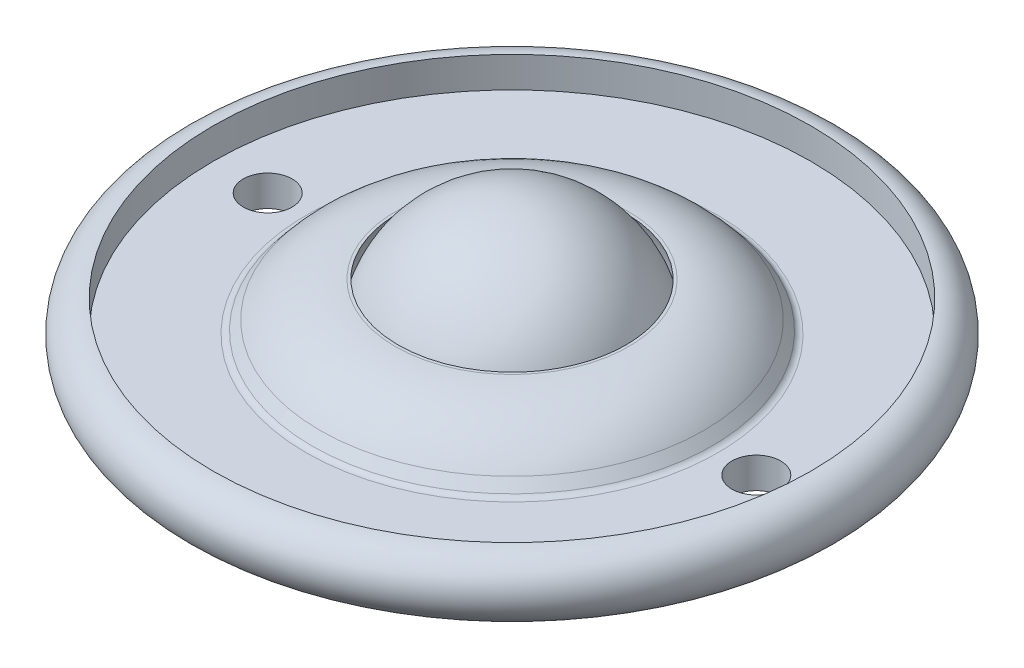
ISO-10303-21;
HEADER;
FILE_DESCRIPTION(('STEP AP214'),'2;1');
FILE_NAME('part.step','',(''),(''),'','','');
FILE_SCHEMA(('AUTOMOTIVE_DESIGN { 1 0 10303 214 1 1 1 1 }'));
ENDSEC;
DATA;
#1=APPLICATION_CONTEXT('core data for automotive mechanical design processes');
#2=APPLICATION_PROTOCOL_DEFINITION('international standard','automotive_design',2000,#1);
#3=PRODUCT_CONTEXT('',#1,'mechanical');
#4=PRODUCT('Part','Part','',(#3));
#5=PRODUCT_RELATED_PRODUCT_CATEGORY('part','',(#4));
#6=PRODUCT_DEFINITION_FORMATION('','',#4);
#7=PRODUCT_DEFINITION_CONTEXT('part definition',#1,'design');
#8=PRODUCT_DEFINITION('design','',#6,#7);
#9=PRODUCT_DEFINITION_SHAPE('','',#8);
#10=(LENGTH_UNIT() NAMED_UNIT(*) SI_UNIT(.MILLI.,.METRE.));
#11=(NAMED_UNIT(*) PLANE_ANGLE_UNIT() SI_UNIT($,.RADIAN.));
#12=(NAMED_UNIT(*) SI_UNIT($,.STERADIAN.) SOLID_ANGLE_UNIT());
#13=UNCERTAINTY_MEASURE_WITH_UNIT(LENGTH_MEASURE(1.E-05),#10,'distance_accuracy_value','');
#14=(GEOMETRIC_REPRESENTATION_CONTEXT(3) GLOBAL_UNCERTAINTY_ASSIGNED_CONTEXT((#13)) GLOBAL_UNIT_ASSIGNED_CONTEXT((#10,
#11,#12)) REPRESENTATION_CONTEXT('',''));
#15=CARTESIAN_POINT('',(0.,0.,0.));
#16=DIRECTION('',(0.,0.,1.));
#17=DIRECTION('',(1.,0.,0.));
#18=AXIS2_PLACEMENT_3D('',#15,#16,#17);
#19=CARTESIAN_POINT('',(0.,0.,0.));
#20=DIRECTION('',(-1.,0.,0.));
#21=DIRECTION('',(0.,-1.,0.));
#22=AXIS2_PLACEMENT_3D('',#19,#20,#21);
#23=SPHERICAL_SURFACE('',#22,7.9375);
#24=CARTESIAN_POINT('',(-7.9375,0.,0.));
#25=VERTEX_POINT('',#24);
#26=VERTEX_LOOP('',#25);
#27=FACE_BOUND('',#26,.T.);
#28=ADVANCED_FACE('P0_F29',(#27),#23,.T.);
#29=CLOSED_SHELL('',(#28));
#30=MANIFOLD_SOLID_BREP('P0_B2',#29);
#31=CARTESIAN_POINT('',(0.,0.,0.));
#32=DIRECTION('',(-1.,0.,0.));
#33=DIRECTION('',(0.,1.,0.));
#34=AXIS2_PLACEMENT_3D('',#31,#32,#33);
#35=SPHERICAL_SURFACE('',#34,8.1915);
#36=CARTESIAN_POINT('',(-8.1915,0.,0.));
#37=VERTEX_POINT('',#36);
#38=VERTEX_LOOP('',#37);
#39=FACE_BOUND('',#38,.T.);
#40=CARTESIAN_POINT('',(8.1915,0.,0.));
#41=VERTEX_POINT('',#40);
#42=VERTEX_LOOP('',#41);
#43=FACE_BOUND('',#42,.T.);
#44=CARTESIAN_POINT('',(7.40612396939182,3.5,0.));
#45=CARTESIAN_POINT('',(7.40612282148996,3.5,0.207940520973274));
#46=CARTESIAN_POINT('',(7.39735917364303,3.5,0.415918737296631));
#47=CARTESIAN_POINT('',(7.36235883640199,3.5,0.830441272775987));
#48=CARTESIAN_POINT('',(7.33611698841852,3.5,1.03698515040484));
#49=CARTESIAN_POINT('',(7.26628707660596,3.5,1.44746340308336));
#50=CARTESIAN_POINT('',(7.22267147766759,3.5,1.65139310289263));
#51=CARTESIAN_POINT('',(7.11836214138648,3.5,2.05501267208273));
#52=CARTESIAN_POINT('',(7.05765454497674,3.49999999999999,2.25469895878464));
#53=CARTESIAN_POINT('',(6.91972793600326,3.49999999999999,2.64789913925064));
#54=CARTESIAN_POINT('',(6.84253753164151,3.5,2.84142306828194));
#55=CARTESIAN_POINT('',(6.67209342038976,3.5,3.22136830532712));
#56=CARTESIAN_POINT('',(6.57883245624484,3.5,3.40778635777037));
#57=CARTESIAN_POINT('',(6.37693084838602,3.5,3.77210822324107));
#58=CARTESIAN_POINT('',(6.26828962845491,3.5,3.95001171693853));
#59=CARTESIAN_POINT('',(6.03645533228709,3.5,4.29595338487754));
#60=CARTESIAN_POINT('',(5.91326884614348,3.5,4.46399597557631));
#61=CARTESIAN_POINT('',(5.65309604669321,3.5,4.78921385581058));
#62=CARTESIAN_POINT('',(5.51610087044069,3.5,4.94638205521472));
#63=CARTESIAN_POINT('',(5.22949034453452,3.5,5.24846755038119));
#64=CARTESIAN_POINT('',(5.07988728997768,3.5,5.39339651175837));
#65=CARTESIAN_POINT('',(4.76893914905491,3.5,5.67020628220635));
#66=CARTESIAN_POINT('',(4.60758877434579,3.5,5.80208115083394));
#67=CARTESIAN_POINT('',(4.27431424591399,3.5,6.05179955301286));
#68=CARTESIAN_POINT('',(4.10238765183991,3.5,6.16963982967398));
#69=CARTESIAN_POINT('',(3.74924544164275,3.5,6.39039786001625));
#70=CARTESIAN_POINT('',(3.56803131925938,3.5,6.49331800321436));
#71=CARTESIAN_POINT('',(3.19757449291373,3.5,6.68352786354436));
#72=CARTESIAN_POINT('',(3.00833168015645,3.5,6.77081736878521));
#73=CARTESIAN_POINT('',(2.62316969562391,3.5,6.92914180103011));
#74=CARTESIAN_POINT('',(2.42725067882988,3.5,7.00017710506387));
#75=CARTESIAN_POINT('',(2.03012265742002,3.5,7.12549144340822));
#76=CARTESIAN_POINT('',(1.82891359229986,3.5,7.1797702859781));
#77=CARTESIAN_POINT('',(1.42268145700651,3.5,7.27117496467168));
#78=CARTESIAN_POINT('',(1.21765920825493,3.5,7.30830445152736));
#79=CARTESIAN_POINT('',(0.805128181684861,3.5,7.36517571451882));
#80=CARTESIAN_POINT('',(0.597618383425741,3.5,7.38491008891321));
#81=CARTESIAN_POINT('',(0.18167391377182,3.5,7.40682383634141));
#82=CARTESIAN_POINT('',(-0.0267607576229801,3.5,7.40900320937523));
#83=CARTESIAN_POINT('',(-0.442983910328806,3.5,7.39579428857053));
#84=CARTESIAN_POINT('',(-0.65077262867887,3.5,7.38041346272286));
#85=CARTESIAN_POINT('',(-1.06436042669156,3.5,7.33220043163075));
#86=CARTESIAN_POINT('',(-1.27015907308772,3.5,7.29936450955197));
#87=CARTESIAN_POINT('',(-1.67825628086044,3.5,7.21647290689108));
#88=CARTESIAN_POINT('',(-1.88055488225887,3.5,7.16641742334583));
#89=CARTESIAN_POINT('',(-2.28022089649986,3.5,7.04944111277211));
#90=CARTESIAN_POINT('',(-2.47758819483629,3.5,6.98251989451618));
#91=CARTESIAN_POINT('',(-2.86598088128762,3.5,6.83228949724596));
#92=CARTESIAN_POINT('',(-3.05700635533038,3.5,6.74898054038156));
#93=CARTESIAN_POINT('',(-3.43139018672869,3.5,6.56655171762853));
#94=CARTESIAN_POINT('',(-3.61474730969693,3.5,6.46742931849346));
#95=CARTESIAN_POINT('',(-3.97241651294724,3.5,6.25411281014373));
#96=CARTESIAN_POINT('',(-4.14673067784701,3.5,6.13992219621416));
#97=CARTESIAN_POINT('',(-4.48504376915096,3.5,5.89731830586787));
#98=CARTESIAN_POINT('',(-4.64904733041881,3.5,5.76891149269166));
#99=CARTESIAN_POINT('',(-4.96581343392468,3.5,5.49861447898287));
#100=CARTESIAN_POINT('',(-5.11856497491781,3.5,5.35671138548374));
#101=CARTESIAN_POINT('',(-5.4114703895838,3.5,5.06063204939761));
#102=CARTESIAN_POINT('',(-5.55163233212859,3.5,4.90646378898311));
#103=CARTESIAN_POINT('',(-5.81853371555242,3.5,4.58679766625113));
#104=CARTESIAN_POINT('',(-5.94526706688843,3.5,4.42129471945854));
#105=CARTESIAN_POINT('',(-6.1843328019622,3.5,4.08020491423173));
#106=CARTESIAN_POINT('',(-6.29666572517306,3.5,3.90461843390686));
#107=CARTESIAN_POINT('',(-6.50608976589227,3.5,3.54468628838141));
#108=CARTESIAN_POINT('',(-6.60318775839457,3.5,3.36034462329925));
#109=CARTESIAN_POINT('',(-6.78166709993964,3.5,2.98381407205134));
#110=CARTESIAN_POINT('',(-6.86302105362819,3.5,2.79161220010966));
#111=CARTESIAN_POINT('',(-7.00916406233124,3.5,2.40118753993073));
#112=CARTESIAN_POINT('',(-7.07396652323318,3.5,2.20296977080772));
#113=CARTESIAN_POINT('',(-7.18654167201185,3.5,1.80210140290721));
#114=CARTESIAN_POINT('',(-7.23434125130595,3.5,1.59945834679411));
#115=CARTESIAN_POINT('',(-7.31270459977394,3.5,1.19090829888798));
#116=CARTESIAN_POINT('',(-7.34327345258538,3.49999999999999,0.985002288226753));
#117=CARTESIAN_POINT('',(-7.3787800101845,3.49999999999999,0.648980674116404));
#118=CARTESIAN_POINT('',(-7.38903079348099,3.5,0.519403359652995));
#119=CARTESIAN_POINT('',(-7.40270313177363,3.5,0.259888937544582));
#120=CARTESIAN_POINT('',(-7.40612468676978,3.5,0.129951829899579));
#121=CARTESIAN_POINT('',(-7.40612282148997,3.5,-0.207940520973277));
#122=CARTESIAN_POINT('',(-7.39735917364303,3.5,-0.415918737296633));
#123=CARTESIAN_POINT('',(-7.36235883640199,3.5,-0.830441272775988));
#124=CARTESIAN_POINT('',(-7.33611698841852,3.5,-1.03698515040484));
#125=CARTESIAN_POINT('',(-7.26628707660596,3.5,-1.44746340308335));
#126=CARTESIAN_POINT('',(-7.22267147766759,3.5,-1.65139310289263));
#127=CARTESIAN_POINT('',(-7.11836214138648,3.5,-2.05501267208273));
#128=CARTESIAN_POINT('',(-7.05765454497674,3.5,-2.25469895878463));
#129=CARTESIAN_POINT('',(-6.91972793600326,3.5,-2.64789913925064));
#130=CARTESIAN_POINT('',(-6.84253753164151,3.5,-2.84142306828193));
#131=CARTESIAN_POINT('',(-6.67209342038976,3.5,-3.22136830532711));
#132=CARTESIAN_POINT('',(-6.57883245624485,3.5,-3.40778635777037));
#133=CARTESIAN_POINT('',(-6.37693084838603,3.5,-3.77210822324106));
#134=CARTESIAN_POINT('',(-6.26828962845491,3.5,-3.95001171693853));
#135=CARTESIAN_POINT('',(-6.0364553322871,3.5,-4.29595338487754));
#136=CARTESIAN_POINT('',(-5.91326884614349,3.5,-4.4639959755763));
#137=CARTESIAN_POINT('',(-5.65309604669322,3.5,-4.78921385581057));
#138=CARTESIAN_POINT('',(-5.5161008704407,3.5,-4.94638205521472));
#139=CARTESIAN_POINT('',(-5.22949034453453,3.5,-5.24846755038118));
#140=CARTESIAN_POINT('',(-5.07988728997768,3.5,-5.39339651175836));
#141=CARTESIAN_POINT('',(-4.76893914905491,3.5,-5.67020628220634));
#142=CARTESIAN_POINT('',(-4.6075887743458,3.5,-5.80208115083393));
#143=CARTESIAN_POINT('',(-4.274314245914,3.5,-6.05179955301286));
#144=CARTESIAN_POINT('',(-4.10238765183992,3.5,-6.16963982967398));
#145=CARTESIAN_POINT('',(-3.74924544164276,3.5,-6.39039786001625));
#146=CARTESIAN_POINT('',(-3.56803131925938,3.5,-6.49331800321436));
#147=CARTESIAN_POINT('',(-3.19757449291374,3.5,-6.68352786354436));
#148=CARTESIAN_POINT('',(-3.00833168015646,3.5,-6.7708173687852));
#149=CARTESIAN_POINT('',(-2.62316969562392,3.5,-6.92914180103011));
#150=CARTESIAN_POINT('',(-2.42725067882989,3.5,-7.00017710506387));
#151=CARTESIAN_POINT('',(-2.03012265742003,3.5,-7.12549144340822));
#152=CARTESIAN_POINT('',(-1.82891359229987,3.5,-7.1797702859781));
#153=CARTESIAN_POINT('',(-1.42268145700652,3.5,-7.27117496467168));
#154=CARTESIAN_POINT('',(-1.21765920825494,3.5,-7.30830445152736));
#155=CARTESIAN_POINT('',(-0.805128181684871,3.5,-7.36517571451882));
#156=CARTESIAN_POINT('',(-0.59761838342575,3.5,-7.38491008891321));
#157=CARTESIAN_POINT('',(-0.181673913771829,3.5,-7.40682383634141));
#158=CARTESIAN_POINT('',(0.0267607576229714,3.5,-7.40900320937523));
#159=CARTESIAN_POINT('',(0.442983910328798,3.5,-7.39579428857053));
#160=CARTESIAN_POINT('',(0.650772628678862,3.5,-7.38041346272286));
#161=CARTESIAN_POINT('',(1.06436042669155,3.5,-7.33220043163075));
#162=CARTESIAN_POINT('',(1.27015907308771,3.5,-7.29936450955197));
#163=CARTESIAN_POINT('',(1.67825628086044,3.5,-7.21647290689108));
#164=CARTESIAN_POINT('',(1.88055488225886,3.5,-7.16641742334584));
#165=CARTESIAN_POINT('',(2.28022089649986,3.5,-7.04944111277211));
#166=CARTESIAN_POINT('',(2.47758819483628,3.5,-6.98251989451618));
#167=CARTESIAN_POINT('',(2.86598088128761,3.5,-6.83228949724596));
#168=CARTESIAN_POINT('',(3.05700635533037,3.5,-6.74898054038156));
#169=CARTESIAN_POINT('',(3.43139018672869,3.5,-6.56655171762853));
#170=CARTESIAN_POINT('',(3.61474730969693,3.5,-6.46742931849347));
#171=CARTESIAN_POINT('',(3.97241651294724,3.5,-6.25411281014374));
#172=CARTESIAN_POINT('',(4.14673067784701,3.5,-6.13992219621417));
#173=CARTESIAN_POINT('',(4.48504376915096,3.5,-5.89731830586787));
#174=CARTESIAN_POINT('',(4.6490473304188,3.5,-5.76891149269166));
#175=CARTESIAN_POINT('',(4.96581343392467,3.5,-5.49861447898287));
#176=CARTESIAN_POINT('',(5.1185649749178,3.5,-5.35671138548374));
#177=CARTESIAN_POINT('',(5.4114703895838,3.5,-5.06063204939761));
#178=CARTESIAN_POINT('',(5.55163233212859,3.5,-4.90646378898311));
#179=CARTESIAN_POINT('',(5.81853371555242,3.5,-4.58679766625113));
#180=CARTESIAN_POINT('',(5.94526706688843,3.5,-4.42129471945855));
#181=CARTESIAN_POINT('',(6.18433280196219,3.5,-4.08020491423174));
#182=CARTESIAN_POINT('',(6.29666572517306,3.5,-3.90461843390687));
#183=CARTESIAN_POINT('',(6.50608976589227,3.5,-3.54468628838142));
#184=CARTESIAN_POINT('',(6.60318775839457,3.5,-3.36034462329925));
#185=CARTESIAN_POINT('',(6.78166709993964,3.5,-2.98381407205134));
#186=CARTESIAN_POINT('',(6.86302105362819,3.5,-2.79161220010966));
#187=CARTESIAN_POINT('',(7.00916406233124,3.5,-2.40118753993073));
#188=CARTESIAN_POINT('',(7.07396652323318,3.5,-2.20296977080772));
#189=CARTESIAN_POINT('',(7.18654167201184,3.5,-1.80210140290721));
#190=CARTESIAN_POINT('',(7.23434125130594,3.5,-1.59945834679412));
#191=CARTESIAN_POINT('',(7.31270459977394,3.5,-1.19090829888798));
#192=CARTESIAN_POINT('',(7.34327345258538,3.49999999999999,-0.985002288226756));
#193=CARTESIAN_POINT('',(7.3787800101845,3.49999999999999,-0.648980674116407));
#194=CARTESIAN_POINT('',(7.38903079348099,3.5,-0.519403359652998));
#195=CARTESIAN_POINT('',(7.40270313177363,3.5,-0.259888937544586));
#196=CARTESIAN_POINT('',(7.40612468676978,3.5,-0.129951829899583));
#197=CARTESIAN_POINT('',(7.40612396939182,3.5,0.));
#198=B_SPLINE_CURVE_WITH_KNOTS('',3,(#44,#45,#46,#47,#48,#49,#50,#51,#52,#53,#54,#55,#56,#57,
#58,#59,#60,#61,#62,#63,#64,#65,#66,#67,#68,#69,#70,#71,#72,#73,#74,#75,#76,#77,#78,#79,#80,#81,
#82,#83,#84,#85,#86,#87,#88,#89,#90,#91,#92,#93,#94,#95,#96,#97,#98,#99,#100,#101,#102,#103,
#104,#105,#106,#107,#108,#109,#110,#111,#112,#113,#114,#115,#116,#117,#118,#119,#120,#121,#122,
#123,#124,#125,#126,#127,#128,#129,#130,#131,#132,#133,#134,#135,#136,#137,#138,#139,#140,#141,
#142,#143,#144,#145,#146,#147,#148,#149,#150,#151,#152,#153,#154,#155,#156,#157,#158,#159,#160,
#161,#162,#163,#164,#165,#166,#167,#168,#169,#170,#171,#172,#173,#174,#175,#176,#177,#178,#179,
#180,#181,#182,#183,#184,#185,#186,#187,#188,#189,#190,#191,#192,#193,#194,#195,#196,#197),
.UNSPECIFIED.,.T.,.F.,(4,2,2,2,2,2,2,2,2,2,2,2,2,2,2,2,2,2,2,2,2,2,2,2,2,2,2,2,2,2,2,2,2,2,2,2,
2,2,2,2,2,2,2,2,2,2,2,2,2,2,2,2,2,2,2,2,2,2,2,2,2,2,2,2,2,2,2,2,2,2,2,2,2,2,2,2,4),(0.,
0.623702573232536,1.2475893102814,1.87246878504293,2.49785641060239,3.12216728593044,
3.74676083430051,4.37137778909822,4.99571282385592,5.62045116372235,6.24458716173389,
6.86900588811867,7.49356923694471,8.11803244877311,8.74250412526884,9.36696131515668,
9.99142565031387,10.6157569889974,11.2403538569475,11.8649507248976,12.4892820635811,
13.1137463987382,13.7382035886261,14.3626752651218,14.9871384769502,15.6117018257763,
16.236120552161,16.8602565501726,17.484994890039,18.1093299247967,18.7339468795944,
19.3585404279645,19.9828513032925,20.608238928852,21.2331184036135,21.8570051406624,
22.4807077138949,22.8704888413314,23.2602699687679,23.8839725420005,24.5078592790493,
25.1327387538109,25.7581263793703,26.3824372546984,27.0070308030684,27.6316477578661,
28.2559827926238,28.8807211324903,29.5048571305018,30.1292758568866,30.7538392057126,
31.378302417541,32.0027740940367,32.6272312839246,33.2516956190818,33.8760269577653,
34.5006238257154,35.1252206936655,35.749552032349,36.3740163675062,36.998473557394,
37.6229452338897,38.2474084457181,38.8719717945442,39.4963905209289,40.1205265189405,
40.7452648588069,41.3695998935646,41.9942168483623,42.6188103967324,43.2431212720604,
43.8685088976199,44.4933883723814,45.1172751094303,45.7409776826628,46.1307588100993,
46.5205399375358),.UNSPECIFIED.);
#199=CARTESIAN_POINT('',(7.40612396939182,3.5,0.));
#200=VERTEX_POINT('',#199);
#201=EDGE_CURVE('P1_E70',#200,#200,#198,.T.);
#202=ORIENTED_EDGE('',*,*,#201,.F.);
#203=EDGE_LOOP('',(#202));
#204=FACE_BOUND('',#203,.T.);
#205=ADVANCED_FACE('P1_F19',(#39,#43,#204),#35,.F.);
#206=CARTESIAN_POINT('',(-7.40612396939182,3.5,0.));
#207=DIRECTION('',(0.,1.,0.));
#208=DIRECTION('',(0.,0.,1.));
#209=AXIS2_PLACEMENT_3D('',#206,#207,#208);
#210=PLANE('',#209);
#211=ORIENTED_EDGE('',*,*,#201,.T.);
#212=EDGE_LOOP('',(#211));
#213=FACE_BOUND('',#212,.T.);
#214=CARTESIAN_POINT('',(0.,3.5,0.));
#215=DIRECTION('',(0.,-1.,0.));
#216=DIRECTION('',(0.,0.,-1.));
#217=AXIS2_PLACEMENT_3D('',#214,#215,#216);
#218=CIRCLE('',#217,7.58935839990471);
#219=CARTESIAN_POINT('',(0.,3.5,-7.58935839990471));
#220=VERTEX_POINT('',#219);
#221=CARTESIAN_POINT('',(0.,3.5,7.58935839990471));
#222=VERTEX_POINT('',#221);
#223=EDGE_CURVE('P1_E79',#220,#222,#218,.T.);
#224=ORIENTED_EDGE('',*,*,#223,.F.);
#225=CARTESIAN_POINT('',(0.,3.5,0.));
#226=DIRECTION('',(0.,-1.,0.));
#227=DIRECTION('',(0.,0.,1.));
#228=AXIS2_PLACEMENT_3D('',#225,#226,#227);
#229=CIRCLE('',#228,7.58935839990471);
#230=EDGE_CURVE('P1_E73',#222,#220,#229,.T.);
#231=ORIENTED_EDGE('',*,*,#230,.F.);
#232=EDGE_LOOP('',(#224,#231));
#233=FACE_BOUND('',#232,.T.);
#234=ADVANCED_FACE('P1_F66',(#213,#233),#210,.T.);
#235=CARTESIAN_POINT('',(0.,-2.85,0.));
#236=DIRECTION('',(0.,1.,0.));
#237=DIRECTION('',(0.,0.,1.));
#238=AXIS2_PLACEMENT_3D('',#235,#236,#237);
#239=TOROIDAL_SURFACE('',#238,7.58935839990471,6.35);
#240=ORIENTED_EDGE('',*,*,#230,.T.);
#241=ORIENTED_EDGE('',*,*,#223,.T.);
#242=EDGE_LOOP('',(#240,#241));
#243=FACE_BOUND('',#242,.T.);
#244=CARTESIAN_POINT('',(0.,1.21513651273868,0.));
#245=DIRECTION('',(0.,-1.,0.));
#246=DIRECTION('',(0.,0.,-1.));
#247=AXIS2_PLACEMENT_3D('',#244,#245,#246);
#248=CIRCLE('',#247,12.4675922127512);
#249=CARTESIAN_POINT('',(0.,1.21513651273868,-12.4675922127512));
#250=VERTEX_POINT('',#249);
#251=EDGE_CURVE('P1_E197',#250,#250,#248,.T.);
#252=ORIENTED_EDGE('',*,*,#251,.F.);
#253=EDGE_LOOP('',(#252));
#254=FACE_BOUND('',#253,.T.);
#255=ADVANCED_FACE('P1_F93',(#243,#254),#239,.T.);
#256=CARTESIAN_POINT('',(0.,0.595289078980899,0.));
#257=DIRECTION('',(0.,-1.,0.));
#258=DIRECTION('',(0.,0.,-1.));
#259=AXIS2_PLACEMENT_3D('',#256,#257,#258);
#260=CONICAL_SURFACE('',#259,12.98412432908,0.694731219291826);
#261=CARTESIAN_POINT('',(0.,0.5952890789809,0.));
#262=DIRECTION('',(0.,1.,0.));
#263=DIRECTION('',(0.,0.,1.));
#264=AXIS2_PLACEMENT_3D('',#261,#262,#263);
#265=CIRCLE('',#264,12.98412432908);
#266=CARTESIAN_POINT('',(0.,0.5952890789809,12.98412432908));
#267=VERTEX_POINT('',#266);
#268=EDGE_CURVE('P1_E202',#267,#267,#265,.T.);
#269=ORIENTED_EDGE('',*,*,#268,.T.);
#270=EDGE_LOOP('',(#269));
#271=FACE_BOUND('',#270,.T.);
#272=ORIENTED_EDGE('',*,*,#251,.T.);
#273=EDGE_LOOP('',(#272));
#274=FACE_BOUND('',#273,.T.);
#275=ADVANCED_FACE('P1_F178',(#271,#274),#260,.T.);
#276=CARTESIAN_POINT('',(0.,0.920499999999993,0.));
#277=DIRECTION('',(0.,1.,0.));
#278=DIRECTION('',(0.,0.,1.));
#279=AXIS2_PLACEMENT_3D('',#276,#277,#278);
#280=TOROIDAL_SURFACE('',#279,13.3743830341077,0.508);
#281=ORIENTED_EDGE('',*,*,#268,.F.);
#282=EDGE_LOOP('',(#281));
#283=FACE_BOUND('',#282,.T.);
#284=CARTESIAN_POINT('',(0.,0.412499999999993,0.));
#285=DIRECTION('',(0.,1.,0.));
#286=DIRECTION('',(0.,0.,-1.));
#287=AXIS2_PLACEMENT_3D('',#284,#285,#286);
#288=CIRCLE('',#287,13.3743830341077);
#289=CARTESIAN_POINT('',(0.,0.412499999999993,13.3743830341077));
#290=VERTEX_POINT('',#289);
#291=CARTESIAN_POINT('',(0.,0.412499999999993,-13.3743830341077));
#292=VERTEX_POINT('',#291);
#293=EDGE_CURVE('P1_E206',#290,#292,#288,.F.);
#294=ORIENTED_EDGE('',*,*,#293,.F.);
#295=CARTESIAN_POINT('',(0.,0.412499999999993,0.));
#296=DIRECTION('',(0.,1.,0.));
#297=DIRECTION('',(0.,0.,1.));
#298=AXIS2_PLACEMENT_3D('',#295,#296,#297);
#299=CIRCLE('',#298,13.3743830341077);
#300=EDGE_CURVE('P1_E330',#292,#290,#299,.F.);
#301=ORIENTED_EDGE('',*,*,#300,.F.);
#302=EDGE_LOOP('',(#294,#301));
#303=FACE_BOUND('',#302,.T.);
#304=ADVANCED_FACE('P1_F175',(#283,#303),#280,.F.);
#305=CARTESIAN_POINT('',(0.,1.59576822916668,0.));
#306=DIRECTION('',(1.,0.,0.));
#307=DIRECTION('',(0.,1.,0.));
#308=AXIS2_PLACEMENT_3D('',#305,#306,#307);
#309=SPHERICAL_SURFACE('',#308,12.7082682291667);
#310=CARTESIAN_POINT('',(0.,-1.95361696403994,0.));
#311=DIRECTION('',(0.,-1.,0.));
#312=DIRECTION('',(0.,0.,-1.));
#313=AXIS2_PLACEMENT_3D('',#310,#311,#312);
#314=CIRCLE('',#313,12.2025385119119);
#315=CARTESIAN_POINT('',(0.,-1.95361696403994,-12.2025385119119));
#316=VERTEX_POINT('',#315);
#317=EDGE_CURVE('P1_E322',#316,#316,#314,.T.);
#318=ORIENTED_EDGE('',*,*,#317,.T.);
#319=EDGE_LOOP('',(#318));
#320=FACE_BOUND('',#319,.T.);
#321=ADVANCED_FACE('P1_F157',(#320),#309,.T.);
#322=CARTESIAN_POINT('',(-13.1364463758704,0.412499999999993,0.));
#323=DIRECTION('',(0.,1.,0.));
#324=DIRECTION('',(0.,0.,1.));
#325=AXIS2_PLACEMENT_3D('',#322,#323,#324);
#326=PLANE('',#325);
#327=CARTESIAN_POINT('',(-15.875,0.412499999999993,0.));
#328=DIRECTION('',(0.,1.,0.));
#329=DIRECTION('',(0.,0.,1.));
#330=AXIS2_PLACEMENT_3D('',#327,#328,#329);
#331=CIRCLE('',#330,1.5875);
#332=CARTESIAN_POINT('',(-15.875,0.412499999999993,1.5875));
#333=VERTEX_POINT('',#332);
#334=EDGE_CURVE('P1_E219',#333,#333,#331,.F.);
#335=ORIENTED_EDGE('',*,*,#334,.T.);
#336=EDGE_LOOP('',(#335));
#337=FACE_BOUND('',#336,.T.);
#338=CARTESIAN_POINT('',(0.,0.412499999999989,0.));
#339=DIRECTION('',(0.,1.,0.));
#340=DIRECTION('',(0.,0.,1.));
#341=AXIS2_PLACEMENT_3D('',#338,#339,#340);
#342=CIRCLE('',#341,19.43125);
#343=CARTESIAN_POINT('',(0.,0.412499999999989,19.43125));
#344=VERTEX_POINT('',#343);
#345=EDGE_CURVE('P1_E86',#344,#344,#342,.T.);
#346=ORIENTED_EDGE('',*,*,#345,.T.);
#347=EDGE_LOOP('',(#346));
#348=FACE_BOUND('',#347,.T.);
#349=CARTESIAN_POINT('',(15.875,0.412499999999993,0.));
#350=DIRECTION('',(0.,1.,0.));
#351=DIRECTION('',(0.,0.,1.));
#352=AXIS2_PLACEMENT_3D('',#349,#350,#351);
#353=CIRCLE('',#352,1.5875);
#354=CARTESIAN_POINT('',(15.875,0.412499999999993,1.5875));
#355=VERTEX_POINT('',#354);
#356=EDGE_CURVE('P1_E319',#355,#355,#353,.F.);
#357=ORIENTED_EDGE('',*,*,#356,.T.);
#358=EDGE_LOOP('',(#357));
#359=FACE_BOUND('',#358,.T.);
#360=ORIENTED_EDGE('',*,*,#293,.T.);
#361=ORIENTED_EDGE('',*,*,#300,.T.);
#362=EDGE_LOOP('',(#360,#361));
#363=FACE_BOUND('',#362,.T.);
#364=ADVANCED_FACE('P1_F146',(#337,#348,#359,#363),#326,.T.);
#365=CARTESIAN_POINT('',(0.,12.5622124451569,0.));
#366=DIRECTION('',(0.,1.,0.));
#367=DIRECTION('',(0.,0.,1.));
#368=AXIS2_PLACEMENT_3D('',#365,#366,#367);
#369=CYLINDRICAL_SURFACE('',#368,19.43125);
#370=CARTESIAN_POINT('',(0.,2.4125,0.));
#371=DIRECTION('',(0.,-1.,0.));
#372=DIRECTION('',(0.,0.,-1.));
#373=AXIS2_PLACEMENT_3D('',#370,#371,#372);
#374=CIRCLE('',#373,19.43125);
#375=CARTESIAN_POINT('',(0.,2.4125,-19.43125));
#376=VERTEX_POINT('',#375);
#377=EDGE_CURVE('P1_E213',#376,#376,#374,.T.);
#378=ORIENTED_EDGE('',*,*,#377,.F.);
#379=EDGE_LOOP('',(#378));
#380=FACE_BOUND('',#379,.T.);
#381=ORIENTED_EDGE('',*,*,#345,.F.);
#382=EDGE_LOOP('',(#381));
#383=FACE_BOUND('',#382,.T.);
#384=ADVANCED_FACE('P1_F156',(#380,#383),#369,.F.);
#385=CARTESIAN_POINT('',(0.,-2.0955,0.));
#386=DIRECTION('',(0.,-1.,0.));
#387=DIRECTION('',(0.,0.,-1.));
#388=AXIS2_PLACEMENT_3D('',#385,#386,#387);
#389=TOROIDAL_SURFACE('',#388,12.6903224846977,0.508);
#390=ORIENTED_EDGE('',*,*,#317,.F.);
#391=EDGE_LOOP('',(#390));
#392=FACE_BOUND('',#391,.T.);
#393=CARTESIAN_POINT('',(0.,-1.5875,0.));
#394=DIRECTION('',(0.,-1.,0.));
#395=DIRECTION('',(0.,0.,1.));
#396=AXIS2_PLACEMENT_3D('',#393,#394,#395);
#397=CIRCLE('',#396,12.6903224846977);
#398=CARTESIAN_POINT('',(0.,-1.5875,-12.6903224846977));
#399=VERTEX_POINT('',#398);
#400=CARTESIAN_POINT('',(0.,-1.5875,12.6903224846977));
#401=VERTEX_POINT('',#400);
#402=EDGE_CURVE('P1_E218',#399,#401,#397,.F.);
#403=ORIENTED_EDGE('',*,*,#402,.F.);
#404=CARTESIAN_POINT('',(0.,-1.5875,0.));
#405=DIRECTION('',(0.,-1.,0.));
#406=DIRECTION('',(0.,0.,-1.));
#407=AXIS2_PLACEMENT_3D('',#404,#405,#406);
#408=CIRCLE('',#407,12.6903224846977);
#409=EDGE_CURVE('P1_E289',#401,#399,#408,.F.);
#410=ORIENTED_EDGE('',*,*,#409,.F.);
#411=EDGE_LOOP('',(#403,#410));
#412=FACE_BOUND('',#411,.T.);
#413=ADVANCED_FACE('P1_F224',(#392,#412),#389,.F.);
#414=CARTESIAN_POINT('',(15.875,-11.1125,0.));
#415=DIRECTION('',(0.,1.,0.));
#416=DIRECTION('',(0.,0.,1.));
#417=AXIS2_PLACEMENT_3D('',#414,#415,#416);
#418=CYLINDRICAL_SURFACE('',#417,1.5875);
#419=CARTESIAN_POINT('',(15.875,-1.58750000000001,0.));
#420=DIRECTION('',(0.,1.,0.));
#421=DIRECTION('',(0.,0.,1.));
#422=AXIS2_PLACEMENT_3D('',#419,#420,#421);
#423=CIRCLE('',#422,1.5875);
#424=CARTESIAN_POINT('',(15.875,-1.58750000000001,1.5875));
#425=VERTEX_POINT('',#424);
#426=EDGE_CURVE('P1_E304',#425,#425,#423,.T.);
#427=ORIENTED_EDGE('',*,*,#426,.F.);
#428=EDGE_LOOP('',(#427));
#429=FACE_BOUND('',#428,.T.);
#430=ORIENTED_EDGE('',*,*,#356,.F.);
#431=EDGE_LOOP('',(#430));
#432=FACE_BOUND('',#431,.T.);
#433=ADVANCED_FACE('P1_F233',(#429,#432),#418,.F.);
#434=CARTESIAN_POINT('',(-15.875,-11.1125,0.));
#435=DIRECTION('',(0.,1.,0.));
#436=DIRECTION('',(0.,0.,1.));
#437=AXIS2_PLACEMENT_3D('',#434,#435,#436);
#438=CYLINDRICAL_SURFACE('',#437,1.5875);
#439=CARTESIAN_POINT('',(-15.875,-1.58750000000001,0.));
#440=DIRECTION('',(0.,1.,0.));
#441=DIRECTION('',(0.,0.,1.));
#442=AXIS2_PLACEMENT_3D('',#439,#440,#441);
#443=CIRCLE('',#442,1.5875);
#444=CARTESIAN_POINT('',(-15.875,-1.58750000000001,1.5875));
#445=VERTEX_POINT('',#444);
#446=EDGE_CURVE('P1_E307',#445,#445,#443,.T.);
#447=ORIENTED_EDGE('',*,*,#446,.F.);
#448=EDGE_LOOP('',(#447));
#449=FACE_BOUND('',#448,.T.);
#450=ORIENTED_EDGE('',*,*,#334,.F.);
#451=EDGE_LOOP('',(#450));
#452=FACE_BOUND('',#451,.T.);
#453=ADVANCED_FACE('P1_F253',(#449,#452),#438,.F.);
#454=CARTESIAN_POINT('',(0.,0.412499999999997,0.));
#455=DIRECTION('',(0.,-1.,0.));
#456=DIRECTION('',(0.,0.,-1.));
#457=AXIS2_PLACEMENT_3D('',#454,#455,#456);
#458=TOROIDAL_SURFACE('',#457,19.43125,2.);
#459=ORIENTED_EDGE('',*,*,#377,.T.);
#460=EDGE_LOOP('',(#459));
#461=FACE_BOUND('',#460,.T.);
#462=CARTESIAN_POINT('',(0.,-1.58750000000001,0.));
#463=DIRECTION('',(0.,1.,0.));
#464=DIRECTION('',(0.,0.,-1.));
#465=AXIS2_PLACEMENT_3D('',#462,#463,#464);
#466=CIRCLE('',#465,19.43125);
#467=CARTESIAN_POINT('',(0.,-1.58750000000001,19.43125));
#468=VERTEX_POINT('',#467);
#469=CARTESIAN_POINT('',(0.,-1.58750000000001,-19.43125));
#470=VERTEX_POINT('',#469);
#471=EDGE_CURVE('P1_E11',#468,#470,#466,.F.);
#472=ORIENTED_EDGE('',*,*,#471,.F.);
#473=CARTESIAN_POINT('',(0.,-1.58750000000001,0.));
#474=DIRECTION('',(0.,1.,0.));
#475=DIRECTION('',(0.,0.,1.));
#476=AXIS2_PLACEMENT_3D('',#473,#474,#475);
#477=CIRCLE('',#476,19.43125);
#478=EDGE_CURVE('P1_E33',#470,#468,#477,.F.);
#479=ORIENTED_EDGE('',*,*,#478,.F.);
#480=EDGE_LOOP('',(#472,#479));
#481=FACE_BOUND('',#480,.T.);
#482=ADVANCED_FACE('P1_F243',(#461,#481),#458,.T.);
#483=CARTESIAN_POINT('',(-12.303125,-1.5875,0.));
#484=DIRECTION('',(0.,-1.,0.));
#485=DIRECTION('',(0.,0.,-1.));
#486=AXIS2_PLACEMENT_3D('',#483,#484,#485);
#487=PLANE('',#486);
#488=ORIENTED_EDGE('',*,*,#478,.T.);
#489=ORIENTED_EDGE('',*,*,#471,.T.);
#490=EDGE_LOOP('',(#488,#489));
#491=FACE_BOUND('',#490,.T.);
#492=ORIENTED_EDGE('',*,*,#446,.T.);
#493=EDGE_LOOP('',(#492));
#494=FACE_BOUND('',#493,.T.);
#495=ORIENTED_EDGE('',*,*,#426,.T.);
#496=EDGE_LOOP('',(#495));
#497=FACE_BOUND('',#496,.T.);
#498=ORIENTED_EDGE('',*,*,#402,.T.);
#499=ORIENTED_EDGE('',*,*,#409,.T.);
#500=EDGE_LOOP('',(#498,#499));
#501=FACE_BOUND('',#500,.T.);
#502=ADVANCED_FACE('P1_F252',(#491,#494,#497,#501),#487,.T.);
#503=CLOSED_SHELL('',(#205,#234,#255,#275,#304,#321,#364,#384,#413,#433,#453,#482,#502));
#504=MANIFOLD_SOLID_BREP('P1_B1',#503);
#505=ADVANCED_BREP_SHAPE_REPRESENTATION('',(#18,#30,#504),#14);
#506=SHAPE_DEFINITION_REPRESENTATION(#9,#505);
ENDSEC;
END-ISO-10303-21;
